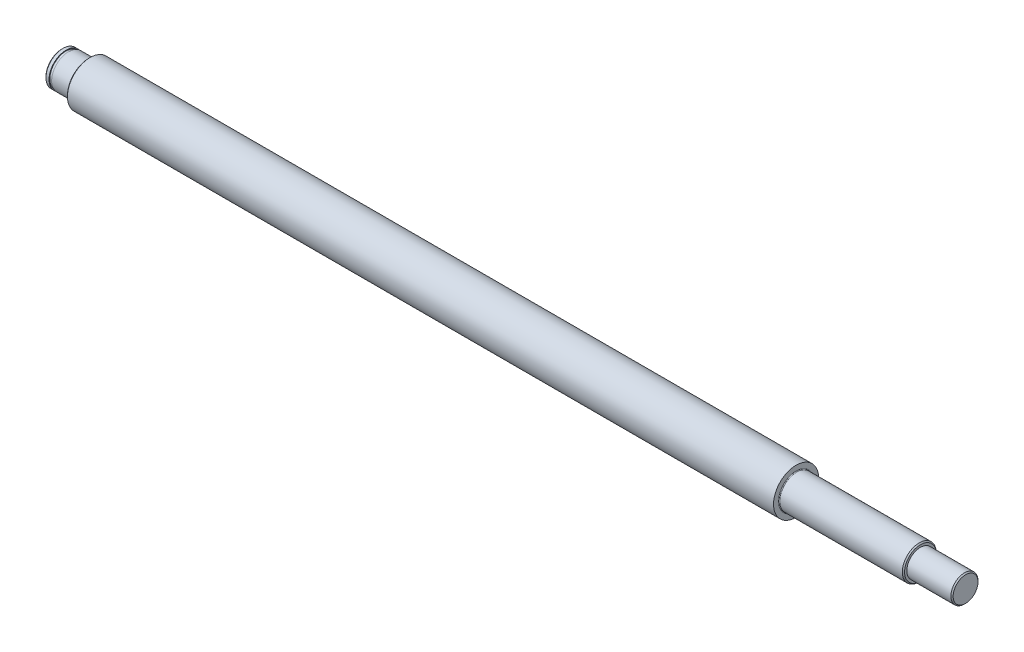
ISO-10303-21;
HEADER;
FILE_DESCRIPTION(('STEP AP214'),'2;1');
FILE_NAME('part.step','',(''),(''),'','','');
FILE_SCHEMA(('AUTOMOTIVE_DESIGN { 1 0 10303 214 1 1 1 1 }'));
ENDSEC;
DATA;
#1=APPLICATION_CONTEXT('core data for automotive mechanical design processes');
#2=APPLICATION_PROTOCOL_DEFINITION('international standard','automotive_design',2000,#1);
#3=PRODUCT_CONTEXT('',#1,'mechanical');
#4=PRODUCT('Part','Part','',(#3));
#5=PRODUCT_RELATED_PRODUCT_CATEGORY('part','',(#4));
#6=PRODUCT_DEFINITION_FORMATION('','',#4);
#7=PRODUCT_DEFINITION_CONTEXT('part definition',#1,'design');
#8=PRODUCT_DEFINITION('design','',#6,#7);
#9=PRODUCT_DEFINITION_SHAPE('','',#8);
#10=(LENGTH_UNIT() NAMED_UNIT(*) SI_UNIT(.MILLI.,.METRE.));
#11=(NAMED_UNIT(*) PLANE_ANGLE_UNIT() SI_UNIT($,.RADIAN.));
#12=(NAMED_UNIT(*) SI_UNIT($,.STERADIAN.) SOLID_ANGLE_UNIT());
#13=UNCERTAINTY_MEASURE_WITH_UNIT(LENGTH_MEASURE(1.E-05),#10,'distance_accuracy_value','');
#14=(GEOMETRIC_REPRESENTATION_CONTEXT(3) GLOBAL_UNCERTAINTY_ASSIGNED_CONTEXT((#13)) GLOBAL_UNIT_ASSIGNED_CONTEXT((#10,
#11,#12)) REPRESENTATION_CONTEXT('',''));
#15=CARTESIAN_POINT('',(0.,0.,0.));
#16=DIRECTION('',(0.,0.,1.));
#17=DIRECTION('',(1.,0.,0.));
#18=AXIS2_PLACEMENT_3D('',#15,#16,#17);
#19=CARTESIAN_POINT('',(-200.,-7.19126770361166,7.));
#20=DIRECTION('',(-1.,0.,0.));
#21=DIRECTION('',(0.,1.,0.));
#22=AXIS2_PLACEMENT_3D('',#19,#20,#21);
#23=PLANE('',#22);
#24=CARTESIAN_POINT('',(-200.,0.,0.));
#25=DIRECTION('',(-1.,0.,0.));
#26=DIRECTION('',(0.,0.,-1.));
#27=AXIS2_PLACEMENT_3D('',#24,#25,#26);
#28=CIRCLE('',#27,7.);
#29=CARTESIAN_POINT('',(-200.,0.,-7.));
#30=VERTEX_POINT('',#29);
#31=EDGE_CURVE('E74',#30,#30,#28,.F.);
#32=ORIENTED_EDGE('',*,*,#31,.F.);
#33=EDGE_LOOP('',(#32));
#34=FACE_BOUND('',#33,.T.);
#35=ADVANCED_FACE('F15',(#34),#23,.T.);
#36=CARTESIAN_POINT('',(-198.15,-7.70492968244106,-7.5));
#37=DIRECTION('',(1.,0.,0.));
#38=DIRECTION('',(0.,1.,0.));
#39=AXIS2_PLACEMENT_3D('',#36,#37,#38);
#40=PLANE('',#39);
#41=CARTESIAN_POINT('',(-198.15,0.,0.));
#42=DIRECTION('',(1.,0.,0.));
#43=DIRECTION('',(0.,0.,1.));
#44=AXIS2_PLACEMENT_3D('',#41,#42,#43);
#45=CIRCLE('',#44,7.5);
#46=CARTESIAN_POINT('',(-198.15,0.,7.5));
#47=VERTEX_POINT('',#46);
#48=EDGE_CURVE('E71',#47,#47,#45,.T.);
#49=ORIENTED_EDGE('',*,*,#48,.T.);
#50=EDGE_LOOP('',(#49));
#51=FACE_BOUND('',#50,.T.);
#52=CARTESIAN_POINT('',(-198.15,0.,0.));
#53=DIRECTION('',(-1.,0.,0.));
#54=DIRECTION('',(0.,0.,-1.));
#55=AXIS2_PLACEMENT_3D('',#52,#53,#54);
#56=CIRCLE('',#55,7.15);
#57=CARTESIAN_POINT('',(-198.15,0.,-7.15));
#58=VERTEX_POINT('',#57);
#59=EDGE_CURVE('E68',#58,#58,#56,.F.);
#60=ORIENTED_EDGE('',*,*,#59,.F.);
#61=EDGE_LOOP('',(#60));
#62=FACE_BOUND('',#61,.T.);
#63=ADVANCED_FACE('F81',(#51,#62),#40,.T.);
#64=CARTESIAN_POINT('',(-197.,-7.70492968244106,7.5));
#65=DIRECTION('',(-1.,0.,0.));
#66=DIRECTION('',(0.,1.,0.));
#67=AXIS2_PLACEMENT_3D('',#64,#65,#66);
#68=PLANE('',#67);
#69=CARTESIAN_POINT('',(-197.,0.,0.));
#70=DIRECTION('',(-1.,0.,0.));
#71=DIRECTION('',(0.,0.,-1.));
#72=AXIS2_PLACEMENT_3D('',#69,#70,#71);
#73=CIRCLE('',#72,7.5);
#74=CARTESIAN_POINT('',(-197.,0.,-7.5));
#75=VERTEX_POINT('',#74);
#76=EDGE_CURVE('E65',#75,#75,#73,.F.);
#77=ORIENTED_EDGE('',*,*,#76,.F.);
#78=EDGE_LOOP('',(#77));
#79=FACE_BOUND('',#78,.T.);
#80=CARTESIAN_POINT('',(-197.,0.,0.));
#81=DIRECTION('',(1.,0.,0.));
#82=DIRECTION('',(0.,0.,1.));
#83=AXIS2_PLACEMENT_3D('',#80,#81,#82);
#84=CIRCLE('',#83,7.15);
#85=CARTESIAN_POINT('',(-197.,0.,7.15));
#86=VERTEX_POINT('',#85);
#87=EDGE_CURVE('E62',#86,#86,#84,.T.);
#88=ORIENTED_EDGE('',*,*,#87,.T.);
#89=EDGE_LOOP('',(#88));
#90=FACE_BOUND('',#89,.T.);
#91=ADVANCED_FACE('F87',(#79,#90),#68,.T.);
#92=CARTESIAN_POINT('',(-188.,-9.75957759775868,9.5));
#93=DIRECTION('',(-1.,0.,0.));
#94=DIRECTION('',(0.,1.,0.));
#95=AXIS2_PLACEMENT_3D('',#92,#93,#94);
#96=PLANE('',#95);
#97=CARTESIAN_POINT('',(-188.,0.,0.));
#98=DIRECTION('',(-1.,0.,0.));
#99=DIRECTION('',(0.,0.,-1.));
#100=AXIS2_PLACEMENT_3D('',#97,#98,#99);
#101=CIRCLE('',#100,9.5);
#102=CARTESIAN_POINT('',(-188.,0.,-9.5));
#103=VERTEX_POINT('',#102);
#104=EDGE_CURVE('E59',#103,#103,#101,.F.);
#105=ORIENTED_EDGE('',*,*,#104,.F.);
#106=EDGE_LOOP('',(#105));
#107=FACE_BOUND('',#106,.T.);
#108=CARTESIAN_POINT('',(-188.,0.,0.));
#109=DIRECTION('',(1.,0.,0.));
#110=DIRECTION('',(0.,0.,1.));
#111=AXIS2_PLACEMENT_3D('',#108,#109,#110);
#112=CIRCLE('',#111,7.8000002215799);
#113=CARTESIAN_POINT('',(-188.,0.,7.8000002215799));
#114=VERTEX_POINT('',#113);
#115=EDGE_CURVE('E56',#114,#114,#112,.T.);
#116=ORIENTED_EDGE('',*,*,#115,.T.);
#117=EDGE_LOOP('',(#116));
#118=FACE_BOUND('',#117,.T.);
#119=ADVANCED_FACE('F93',(#107,#118),#96,.T.);
#120=CARTESIAN_POINT('',(125.,-10.2732395765881,-10.));
#121=DIRECTION('',(1.,0.,0.));
#122=DIRECTION('',(0.,1.,0.));
#123=AXIS2_PLACEMENT_3D('',#120,#121,#122);
#124=PLANE('',#123);
#125=CARTESIAN_POINT('',(125.,0.,0.));
#126=DIRECTION('',(1.,0.,0.));
#127=DIRECTION('',(0.,0.,1.));
#128=AXIS2_PLACEMENT_3D('',#125,#126,#127);
#129=CIRCLE('',#128,10.);
#130=CARTESIAN_POINT('',(125.,0.,10.));
#131=VERTEX_POINT('',#130);
#132=EDGE_CURVE('E53',#131,#131,#129,.T.);
#133=ORIENTED_EDGE('',*,*,#132,.T.);
#134=EDGE_LOOP('',(#133));
#135=FACE_BOUND('',#134,.T.);
#136=CARTESIAN_POINT('',(125.,0.,0.));
#137=DIRECTION('',(-1.,0.,0.));
#138=DIRECTION('',(0.,0.,-1.));
#139=AXIS2_PLACEMENT_3D('',#136,#137,#138);
#140=CIRCLE('',#139,7.80000017416463);
#141=CARTESIAN_POINT('',(125.,0.,-7.80000017416463));
#142=VERTEX_POINT('',#141);
#143=EDGE_CURVE('E50',#142,#142,#140,.F.);
#144=ORIENTED_EDGE('',*,*,#143,.F.);
#145=EDGE_LOOP('',(#144));
#146=FACE_BOUND('',#145,.T.);
#147=ADVANCED_FACE('F97',(#135,#146),#124,.T.);
#148=CARTESIAN_POINT('',(180.,-7.19126770361165,-7.));
#149=DIRECTION('',(1.,0.,0.));
#150=DIRECTION('',(0.,1.,0.));
#151=AXIS2_PLACEMENT_3D('',#148,#149,#150);
#152=PLANE('',#151);
#153=CARTESIAN_POINT('',(180.,0.,0.));
#154=DIRECTION('',(1.,0.,0.));
#155=DIRECTION('',(0.,0.,1.));
#156=AXIS2_PLACEMENT_3D('',#153,#154,#155);
#157=CIRCLE('',#156,7.);
#158=CARTESIAN_POINT('',(180.,0.,7.));
#159=VERTEX_POINT('',#158);
#160=EDGE_CURVE('E47',#159,#159,#157,.T.);
#161=ORIENTED_EDGE('',*,*,#160,.T.);
#162=EDGE_LOOP('',(#161));
#163=FACE_BOUND('',#162,.T.);
#164=CARTESIAN_POINT('',(180.,0.,0.));
#165=DIRECTION('',(-1.,0.,0.));
#166=DIRECTION('',(0.,0.,-1.));
#167=AXIS2_PLACEMENT_3D('',#164,#165,#166);
#168=CIRCLE('',#167,6.);
#169=CARTESIAN_POINT('',(180.,0.,-6.));
#170=VERTEX_POINT('',#169);
#171=EDGE_CURVE('E44',#170,#170,#168,.F.);
#172=ORIENTED_EDGE('',*,*,#171,.F.);
#173=EDGE_LOOP('',(#172));
#174=FACE_BOUND('',#173,.T.);
#175=ADVANCED_FACE('F101',(#163,#174),#152,.T.);
#176=CARTESIAN_POINT('',(200.,-5.5,-5.5));
#177=DIRECTION('',(1.,0.,0.));
#178=DIRECTION('',(0.,1.,0.));
#179=AXIS2_PLACEMENT_3D('',#176,#177,#178);
#180=PLANE('',#179);
#181=CARTESIAN_POINT('',(200.,0.,0.));
#182=DIRECTION('',(1.,0.,0.));
#183=DIRECTION('',(0.,0.,1.));
#184=AXIS2_PLACEMENT_3D('',#181,#182,#183);
#185=CIRCLE('',#184,5.5);
#186=CARTESIAN_POINT('',(200.,0.,5.5));
#187=VERTEX_POINT('',#186);
#188=EDGE_CURVE('E41',#187,#187,#185,.T.);
#189=ORIENTED_EDGE('',*,*,#188,.T.);
#190=EDGE_LOOP('',(#189));
#191=FACE_BOUND('',#190,.T.);
#192=ADVANCED_FACE('F105',(#191),#180,.T.);
#193=CARTESIAN_POINT('',(-199.5,0.,0.));
#194=DIRECTION('',(1.,0.,0.));
#195=DIRECTION('',(0.,1.92343152856519E-10,1.));
#196=AXIS2_PLACEMENT_3D('',#193,#194,#195);
#197=CONICAL_SURFACE('',#196,7.5,0.785398163397447);
#198=CARTESIAN_POINT('',(-199.5,0.,0.));
#199=DIRECTION('',(-1.,0.,0.));
#200=DIRECTION('',(0.,0.,-1.));
#201=AXIS2_PLACEMENT_3D('',#198,#199,#200);
#202=CIRCLE('',#201,7.5);
#203=CARTESIAN_POINT('',(-199.5,0.,-7.5));
#204=VERTEX_POINT('',#203);
#205=EDGE_CURVE('E38',#204,#204,#202,.F.);
#206=ORIENTED_EDGE('',*,*,#205,.F.);
#207=EDGE_LOOP('',(#206));
#208=FACE_BOUND('',#207,.T.);
#209=ORIENTED_EDGE('',*,*,#31,.T.);
#210=EDGE_LOOP('',(#209));
#211=FACE_BOUND('',#210,.T.);
#212=ADVANCED_FACE('F78',(#208,#211),#197,.T.);
#213=CARTESIAN_POINT('',(200.,0.,0.));
#214=DIRECTION('',(1.,0.,0.));
#215=DIRECTION('',(0.,7.69370911764408E-10,1.));
#216=AXIS2_PLACEMENT_3D('',#213,#214,#215);
#217=CYLINDRICAL_SURFACE('',#216,7.5);
#218=ORIENTED_EDGE('',*,*,#48,.F.);
#219=EDGE_LOOP('',(#218));
#220=FACE_BOUND('',#219,.T.);
#221=ORIENTED_EDGE('',*,*,#205,.T.);
#222=EDGE_LOOP('',(#221));
#223=FACE_BOUND('',#222,.T.);
#224=ADVANCED_FACE('F112',(#220,#223),#217,.T.);
#225=CARTESIAN_POINT('',(200.,0.,0.));
#226=DIRECTION('',(1.,0.,0.));
#227=DIRECTION('',(0.,0.,1.));
#228=AXIS2_PLACEMENT_3D('',#225,#226,#227);
#229=CYLINDRICAL_SURFACE('',#228,7.15);
#230=ORIENTED_EDGE('',*,*,#87,.F.);
#231=EDGE_LOOP('',(#230));
#232=FACE_BOUND('',#231,.T.);
#233=ORIENTED_EDGE('',*,*,#59,.T.);
#234=EDGE_LOOP('',(#233));
#235=FACE_BOUND('',#234,.T.);
#236=ADVANCED_FACE('F116',(#232,#235),#229,.T.);
#237=CARTESIAN_POINT('',(200.,0.,0.));
#238=DIRECTION('',(1.,0.,0.));
#239=DIRECTION('',(0.,1.92343152856519E-10,1.));
#240=AXIS2_PLACEMENT_3D('',#237,#238,#239);
#241=CYLINDRICAL_SURFACE('',#240,7.5);
#242=CARTESIAN_POINT('',(-188.3,0.,0.));
#243=DIRECTION('',(-1.,0.,0.));
#244=DIRECTION('',(0.,0.,-1.));
#245=AXIS2_PLACEMENT_3D('',#242,#243,#244);
#246=CIRCLE('',#245,7.5);
#247=CARTESIAN_POINT('',(-188.3,0.,-7.5));
#248=VERTEX_POINT('',#247);
#249=EDGE_CURVE('E35',#248,#248,#246,.F.);
#250=ORIENTED_EDGE('',*,*,#249,.F.);
#251=EDGE_LOOP('',(#250));
#252=FACE_BOUND('',#251,.T.);
#253=ORIENTED_EDGE('',*,*,#76,.T.);
#254=EDGE_LOOP('',(#253));
#255=FACE_BOUND('',#254,.T.);
#256=ADVANCED_FACE('F120',(#252,#255),#241,.T.);
#257=CARTESIAN_POINT('',(-188.299999999993,0.,0.));
#258=DIRECTION('',(1.,0.,0.));
#259=DIRECTION('',(0.,7.69372244032038E-10,1.));
#260=AXIS2_PLACEMENT_3D('',#257,#258,#259);
#261=TOROIDAL_SURFACE('',#260,7.79999999999307,0.299999999993073);
#262=ORIENTED_EDGE('',*,*,#115,.F.);
#263=EDGE_LOOP('',(#262));
#264=FACE_BOUND('',#263,.T.);
#265=ORIENTED_EDGE('',*,*,#249,.T.);
#266=EDGE_LOOP('',(#265));
#267=FACE_BOUND('',#266,.T.);
#268=ADVANCED_FACE('F124',(#264,#267),#261,.F.);
#269=CARTESIAN_POINT('',(-187.5,0.,0.));
#270=DIRECTION('',(1.,0.,0.));
#271=DIRECTION('',(0.,1.92343152856519E-10,1.));
#272=AXIS2_PLACEMENT_3D('',#269,#270,#271);
#273=CONICAL_SURFACE('',#272,10.,0.785398163397448);
#274=CARTESIAN_POINT('',(-187.5,0.,0.));
#275=DIRECTION('',(-1.,0.,0.));
#276=DIRECTION('',(0.,0.,-1.));
#277=AXIS2_PLACEMENT_3D('',#274,#275,#276);
#278=CIRCLE('',#277,10.);
#279=CARTESIAN_POINT('',(-187.5,0.,-10.));
#280=VERTEX_POINT('',#279);
#281=EDGE_CURVE('E30',#280,#280,#278,.F.);
#282=ORIENTED_EDGE('',*,*,#281,.F.);
#283=EDGE_LOOP('',(#282));
#284=FACE_BOUND('',#283,.T.);
#285=ORIENTED_EDGE('',*,*,#104,.T.);
#286=EDGE_LOOP('',(#285));
#287=FACE_BOUND('',#286,.T.);
#288=ADVANCED_FACE('F128',(#284,#287),#273,.T.);
#289=CARTESIAN_POINT('',(200.,0.,0.));
#290=DIRECTION('',(1.,0.,0.));
#291=DIRECTION('',(0.,7.69370911764408E-10,1.));
#292=AXIS2_PLACEMENT_3D('',#289,#290,#291);
#293=CYLINDRICAL_SURFACE('',#292,10.);
#294=ORIENTED_EDGE('',*,*,#132,.F.);
#295=EDGE_LOOP('',(#294));
#296=FACE_BOUND('',#295,.T.);
#297=ORIENTED_EDGE('',*,*,#281,.T.);
#298=EDGE_LOOP('',(#297));
#299=FACE_BOUND('',#298,.T.);
#300=ADVANCED_FACE('F132',(#296,#299),#293,.T.);
#301=CARTESIAN_POINT('',(125.299999999993,0.,0.));
#302=DIRECTION('',(1.,0.,0.));
#303=DIRECTION('',(0.,0.,1.));
#304=AXIS2_PLACEMENT_3D('',#301,#302,#303);
#305=TOROIDAL_SURFACE('',#304,7.79999999999307,0.299999999993056);
#306=CARTESIAN_POINT('',(125.3,0.,0.));
#307=DIRECTION('',(-1.,0.,0.));
#308=DIRECTION('',(0.,0.,-1.));
#309=AXIS2_PLACEMENT_3D('',#306,#307,#308);
#310=CIRCLE('',#309,7.50000000000001);
#311=CARTESIAN_POINT('',(125.3,0.,-7.50000000000001));
#312=VERTEX_POINT('',#311);
#313=EDGE_CURVE('E26',#312,#312,#310,.F.);
#314=ORIENTED_EDGE('',*,*,#313,.F.);
#315=EDGE_LOOP('',(#314));
#316=FACE_BOUND('',#315,.T.);
#317=ORIENTED_EDGE('',*,*,#143,.T.);
#318=EDGE_LOOP('',(#317));
#319=FACE_BOUND('',#318,.T.);
#320=ADVANCED_FACE('F136',(#316,#319),#305,.F.);
#321=CARTESIAN_POINT('',(200.,0.,0.));
#322=DIRECTION('',(1.,0.,0.));
#323=DIRECTION('',(0.,0.,1.));
#324=AXIS2_PLACEMENT_3D('',#321,#322,#323);
#325=CYLINDRICAL_SURFACE('',#324,7.5);
#326=CARTESIAN_POINT('',(179.5,0.,0.));
#327=DIRECTION('',(-1.,0.,0.));
#328=DIRECTION('',(0.,0.,-1.));
#329=AXIS2_PLACEMENT_3D('',#326,#327,#328);
#330=CIRCLE('',#329,7.5);
#331=CARTESIAN_POINT('',(179.5,0.,-7.5));
#332=VERTEX_POINT('',#331);
#333=EDGE_CURVE('E22',#332,#332,#330,.F.);
#334=ORIENTED_EDGE('',*,*,#333,.F.);
#335=EDGE_LOOP('',(#334));
#336=FACE_BOUND('',#335,.T.);
#337=ORIENTED_EDGE('',*,*,#313,.T.);
#338=EDGE_LOOP('',(#337));
#339=FACE_BOUND('',#338,.T.);
#340=ADVANCED_FACE('F140',(#336,#339),#325,.T.);
#341=CARTESIAN_POINT('',(179.5,0.,0.));
#342=DIRECTION('',(-1.,0.,0.));
#343=DIRECTION('',(0.,0.,-1.));
#344=AXIS2_PLACEMENT_3D('',#341,#342,#343);
#345=CONICAL_SURFACE('',#344,7.5,0.785398163397447);
#346=ORIENTED_EDGE('',*,*,#160,.F.);
#347=EDGE_LOOP('',(#346));
#348=FACE_BOUND('',#347,.T.);
#349=ORIENTED_EDGE('',*,*,#333,.T.);
#350=EDGE_LOOP('',(#349));
#351=FACE_BOUND('',#350,.T.);
#352=ADVANCED_FACE('F144',(#348,#351),#345,.T.);
#353=CARTESIAN_POINT('',(200.,0.,0.));
#354=DIRECTION('',(1.,0.,0.));
#355=DIRECTION('',(0.,0.,1.));
#356=AXIS2_PLACEMENT_3D('',#353,#354,#355);
#357=CYLINDRICAL_SURFACE('',#356,6.);
#358=CARTESIAN_POINT('',(199.5,0.,0.));
#359=DIRECTION('',(-1.,0.,0.));
#360=DIRECTION('',(0.,0.,-1.));
#361=AXIS2_PLACEMENT_3D('',#358,#359,#360);
#362=CIRCLE('',#361,6.);
#363=CARTESIAN_POINT('',(199.5,0.,-6.));
#364=VERTEX_POINT('',#363);
#365=EDGE_CURVE('E10',#364,#364,#362,.F.);
#366=ORIENTED_EDGE('',*,*,#365,.F.);
#367=EDGE_LOOP('',(#366));
#368=FACE_BOUND('',#367,.T.);
#369=ORIENTED_EDGE('',*,*,#171,.T.);
#370=EDGE_LOOP('',(#369));
#371=FACE_BOUND('',#370,.T.);
#372=ADVANCED_FACE('F147',(#368,#371),#357,.T.);
#373=CARTESIAN_POINT('',(199.5,0.,0.));
#374=DIRECTION('',(-1.,0.,0.));
#375=DIRECTION('',(0.,0.,-1.));
#376=AXIS2_PLACEMENT_3D('',#373,#374,#375);
#377=CONICAL_SURFACE('',#376,6.,0.785398163397447);
#378=ORIENTED_EDGE('',*,*,#188,.F.);
#379=EDGE_LOOP('',(#378));
#380=FACE_BOUND('',#379,.T.);
#381=ORIENTED_EDGE('',*,*,#365,.T.);
#382=EDGE_LOOP('',(#381));
#383=FACE_BOUND('',#382,.T.);
#384=ADVANCED_FACE('F17',(#380,#383),#377,.T.);
#385=CLOSED_SHELL('',(#35,#63,#91,#119,#147,#175,#192,#212,#224,#236,#256,#268,#288,#300,#320,
#340,#352,#372,#384));
#386=MANIFOLD_SOLID_BREP('B1',#385);
#387=ADVANCED_BREP_SHAPE_REPRESENTATION('',(#18,#386),#14);
#388=SHAPE_DEFINITION_REPRESENTATION(#9,#387);
ENDSEC;
END-ISO-10303-21;
